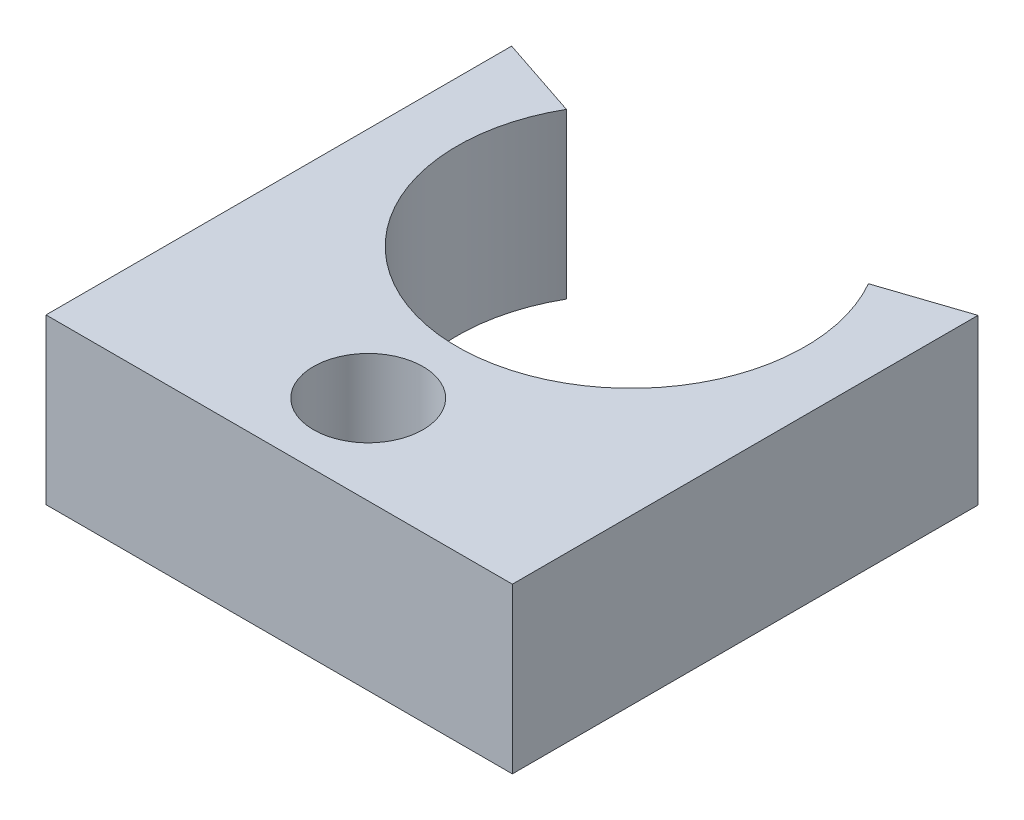
ISO-10303-21;
HEADER;
FILE_DESCRIPTION(('STEP AP214'),'2;1');
FILE_NAME('part.step','',(''),(''),'','','');
FILE_SCHEMA(('AUTOMOTIVE_DESIGN { 1 0 10303 214 1 1 1 1 }'));
ENDSEC;
DATA;
#1=APPLICATION_CONTEXT('core data for automotive mechanical design processes');
#2=APPLICATION_PROTOCOL_DEFINITION('international standard','automotive_design',2000,#1);
#3=PRODUCT_CONTEXT('',#1,'mechanical');
#4=PRODUCT('Part','Part','',(#3));
#5=PRODUCT_RELATED_PRODUCT_CATEGORY('part','',(#4));
#6=PRODUCT_DEFINITION_FORMATION('','',#4);
#7=PRODUCT_DEFINITION_CONTEXT('part definition',#1,'design');
#8=PRODUCT_DEFINITION('design','',#6,#7);
#9=PRODUCT_DEFINITION_SHAPE('','',#8);
#10=(LENGTH_UNIT() NAMED_UNIT(*) SI_UNIT(.MILLI.,.METRE.));
#11=(NAMED_UNIT(*) PLANE_ANGLE_UNIT() SI_UNIT($,.RADIAN.));
#12=(NAMED_UNIT(*) SI_UNIT($,.STERADIAN.) SOLID_ANGLE_UNIT());
#13=UNCERTAINTY_MEASURE_WITH_UNIT(LENGTH_MEASURE(1.E-05),#10,'distance_accuracy_value','');
#14=(GEOMETRIC_REPRESENTATION_CONTEXT(3) GLOBAL_UNCERTAINTY_ASSIGNED_CONTEXT((#13)) GLOBAL_UNIT_ASSIGNED_CONTEXT((#10,
#11,#12)) REPRESENTATION_CONTEXT('',''));
#15=CARTESIAN_POINT('',(0.,0.,0.));
#16=DIRECTION('',(0.,0.,1.));
#17=DIRECTION('',(1.,0.,0.));
#18=AXIS2_PLACEMENT_3D('',#15,#16,#17);
#19=CARTESIAN_POINT('',(-17.0272390016722,12.,-25.7));
#20=DIRECTION('',(0.,1.,0.));
#21=DIRECTION('',(0.,0.,1.));
#22=AXIS2_PLACEMENT_3D('',#19,#20,#21);
#23=PLANE('',#22);
#24=DIRECTION('',(-0.948683298050514,0.,-0.316227766016838));
#25=VECTOR('',#24,1.);
#26=CARTESIAN_POINT('',(-34.0544780033444,12.,-34.));
#27=LINE('',#26,#25);
#28=CARTESIAN_POINT('',(-28.0544780033444,12.,-32.));
#29=VERTEX_POINT('',#28);
#30=CARTESIAN_POINT('',(-34.0544780033444,12.,-34.));
#31=VERTEX_POINT('',#30);
#32=EDGE_CURVE('E152',#29,#31,#27,.T.);
#33=ORIENTED_EDGE('',*,*,#32,.T.);
#34=DIRECTION('',(0.,0.,1.));
#35=VECTOR('',#34,1.);
#36=CARTESIAN_POINT('',(-34.0544780033444,12.,-34.));
#37=LINE('',#36,#35);
#38=CARTESIAN_POINT('',(-34.0544780033444,12.,0.));
#39=VERTEX_POINT('',#38);
#40=EDGE_CURVE('E100',#31,#39,#37,.T.);
#41=ORIENTED_EDGE('',*,*,#40,.T.);
#42=DIRECTION('',(1.,0.,0.));
#43=VECTOR('',#42,1.);
#44=CARTESIAN_POINT('',(-34.0544780033444,12.,0.));
#45=LINE('',#44,#43);
#46=CARTESIAN_POINT('',(0.,12.,0.));
#47=VERTEX_POINT('',#46);
#48=EDGE_CURVE('E113',#39,#47,#45,.T.);
#49=ORIENTED_EDGE('',*,*,#48,.T.);
#50=DIRECTION('',(0.,0.,-1.));
#51=VECTOR('',#50,1.);
#52=CARTESIAN_POINT('',(0.,12.,0.));
#53=LINE('',#52,#51);
#54=CARTESIAN_POINT('',(0.,12.,-34.));
#55=VERTEX_POINT('',#54);
#56=EDGE_CURVE('E107',#47,#55,#53,.T.);
#57=ORIENTED_EDGE('',*,*,#56,.T.);
#58=DIRECTION('',(-0.948683298050515,0.,0.316227766016836));
#59=VECTOR('',#58,1.);
#60=CARTESIAN_POINT('',(0.,12.,-34.));
#61=LINE('',#60,#59);
#62=CARTESIAN_POINT('',(-6.00000000000001,12.,-32.));
#63=VERTEX_POINT('',#62);
#64=EDGE_CURVE('E111',#55,#63,#61,.T.);
#65=ORIENTED_EDGE('',*,*,#64,.T.);
#66=CARTESIAN_POINT('',(-17.0272390016722,12.,-25.7));
#67=DIRECTION('',(0.,-1.,0.));
#68=DIRECTION('',(0.,0.,1.));
#69=AXIS2_PLACEMENT_3D('',#66,#67,#68);
#70=CIRCLE('',#69,12.7);
#71=EDGE_CURVE('E63',#63,#29,#70,.T.);
#72=ORIENTED_EDGE('',*,*,#71,.T.);
#73=EDGE_LOOP('',(#33,#41,#49,#57,#65,#72));
#74=FACE_BOUND('',#73,.T.);
#75=CARTESIAN_POINT('',(-17.0272390016722,12.,-6.5));
#76=DIRECTION('',(0.,1.,0.));
#77=DIRECTION('',(0.,0.,1.));
#78=AXIS2_PLACEMENT_3D('',#75,#76,#77);
#79=CIRCLE('',#78,4.);
#80=CARTESIAN_POINT('',(-17.0272390016722,12.,-2.49999999999999));
#81=VERTEX_POINT('',#80);
#82=EDGE_CURVE('E140',#81,#81,#79,.T.);
#83=ORIENTED_EDGE('',*,*,#82,.F.);
#84=EDGE_LOOP('',(#83));
#85=FACE_BOUND('',#84,.T.);
#86=ADVANCED_FACE('F45',(#74,#85),#23,.T.);
#87=CARTESIAN_POINT('',(-17.0272390016722,0.,-25.7));
#88=DIRECTION('',(0.,1.,0.));
#89=DIRECTION('',(0.,0.,1.));
#90=AXIS2_PLACEMENT_3D('',#87,#88,#89);
#91=PLANE('',#90);
#92=DIRECTION('',(-0.948683298050514,0.,-0.316227766016838));
#93=VECTOR('',#92,1.);
#94=CARTESIAN_POINT('',(-34.0544780033444,0.,-34.));
#95=LINE('',#94,#93);
#96=CARTESIAN_POINT('',(-28.0544780033444,0.,-32.));
#97=VERTEX_POINT('',#96);
#98=CARTESIAN_POINT('',(-34.0544780033444,0.,-34.));
#99=VERTEX_POINT('',#98);
#100=EDGE_CURVE('E135',#97,#99,#95,.T.);
#101=ORIENTED_EDGE('',*,*,#100,.F.);
#102=CARTESIAN_POINT('',(-17.0272390016722,0.,-25.7));
#103=DIRECTION('',(0.,-1.,0.));
#104=DIRECTION('',(0.,0.,1.));
#105=AXIS2_PLACEMENT_3D('',#102,#103,#104);
#106=CIRCLE('',#105,12.7);
#107=CARTESIAN_POINT('',(-6.00000000000001,0.,-32.));
#108=VERTEX_POINT('',#107);
#109=EDGE_CURVE('E92',#108,#97,#106,.T.);
#110=ORIENTED_EDGE('',*,*,#109,.F.);
#111=DIRECTION('',(-0.948683298050515,0.,0.316227766016836));
#112=VECTOR('',#111,1.);
#113=CARTESIAN_POINT('',(0.,0.,-34.));
#114=LINE('',#113,#112);
#115=CARTESIAN_POINT('',(0.,0.,-34.));
#116=VERTEX_POINT('',#115);
#117=EDGE_CURVE('E86',#116,#108,#114,.T.);
#118=ORIENTED_EDGE('',*,*,#117,.F.);
#119=DIRECTION('',(0.,0.,-1.));
#120=VECTOR('',#119,1.);
#121=CARTESIAN_POINT('',(0.,0.,0.));
#122=LINE('',#121,#120);
#123=CARTESIAN_POINT('',(0.,0.,0.));
#124=VERTEX_POINT('',#123);
#125=EDGE_CURVE('E122',#124,#116,#122,.T.);
#126=ORIENTED_EDGE('',*,*,#125,.F.);
#127=DIRECTION('',(1.,0.,0.));
#128=VECTOR('',#127,1.);
#129=CARTESIAN_POINT('',(-34.0544780033444,0.,0.));
#130=LINE('',#129,#128);
#131=CARTESIAN_POINT('',(-34.0544780033444,0.,0.));
#132=VERTEX_POINT('',#131);
#133=EDGE_CURVE('E143',#132,#124,#130,.T.);
#134=ORIENTED_EDGE('',*,*,#133,.F.);
#135=DIRECTION('',(0.,0.,1.));
#136=VECTOR('',#135,1.);
#137=CARTESIAN_POINT('',(-34.0544780033444,0.,-34.));
#138=LINE('',#137,#136);
#139=EDGE_CURVE('E139',#99,#132,#138,.T.);
#140=ORIENTED_EDGE('',*,*,#139,.F.);
#141=EDGE_LOOP('',(#101,#110,#118,#126,#134,#140));
#142=FACE_BOUND('',#141,.T.);
#143=CARTESIAN_POINT('',(-17.0272390016722,0.,-6.5));
#144=DIRECTION('',(0.,1.,0.));
#145=DIRECTION('',(0.,0.,1.));
#146=AXIS2_PLACEMENT_3D('',#143,#144,#145);
#147=CIRCLE('',#146,4.);
#148=CARTESIAN_POINT('',(-17.0272390016722,0.,-2.49999999999999));
#149=VERTEX_POINT('',#148);
#150=EDGE_CURVE('E249',#149,#149,#147,.T.);
#151=ORIENTED_EDGE('',*,*,#150,.T.);
#152=EDGE_LOOP('',(#151));
#153=FACE_BOUND('',#152,.T.);
#154=ADVANCED_FACE('F165',(#142,#153),#91,.F.);
#155=CARTESIAN_POINT('',(-34.0544780033444,12.,-34.));
#156=DIRECTION('',(-0.316227766016838,0.,0.948683298050514));
#157=DIRECTION('',(0.948683298050514,0.,0.316227766016838));
#158=AXIS2_PLACEMENT_3D('',#155,#156,#157);
#159=PLANE('',#158);
#160=ORIENTED_EDGE('',*,*,#100,.T.);
#161=DIRECTION('',(0.,-1.,0.));
#162=VECTOR('',#161,1.);
#163=CARTESIAN_POINT('',(-34.0544780033444,12.,-34.));
#164=LINE('',#163,#162);
#165=EDGE_CURVE('E11',#31,#99,#164,.T.);
#166=ORIENTED_EDGE('',*,*,#165,.F.);
#167=ORIENTED_EDGE('',*,*,#32,.F.);
#168=DIRECTION('',(0.,-1.,0.));
#169=VECTOR('',#168,1.);
#170=CARTESIAN_POINT('',(-28.0544780033444,12.,-32.));
#171=LINE('',#170,#169);
#172=EDGE_CURVE('E131',#29,#97,#171,.T.);
#173=ORIENTED_EDGE('',*,*,#172,.T.);
#174=EDGE_LOOP('',(#160,#166,#167,#173));
#175=FACE_BOUND('',#174,.T.);
#176=ADVANCED_FACE('F47',(#175),#159,.F.);
#177=CARTESIAN_POINT('',(-34.0544780033444,12.,-34.));
#178=DIRECTION('',(1.,0.,0.));
#179=DIRECTION('',(0.,0.,-1.));
#180=AXIS2_PLACEMENT_3D('',#177,#178,#179);
#181=PLANE('',#180);
#182=ORIENTED_EDGE('',*,*,#139,.T.);
#183=DIRECTION('',(0.,-1.,0.));
#184=VECTOR('',#183,1.);
#185=CARTESIAN_POINT('',(-34.0544780033444,12.,0.));
#186=LINE('',#185,#184);
#187=EDGE_CURVE('E55',#39,#132,#186,.T.);
#188=ORIENTED_EDGE('',*,*,#187,.F.);
#189=ORIENTED_EDGE('',*,*,#40,.F.);
#190=ORIENTED_EDGE('',*,*,#165,.T.);
#191=EDGE_LOOP('',(#182,#188,#189,#190));
#192=FACE_BOUND('',#191,.T.);
#193=ADVANCED_FACE('F190',(#192),#181,.F.);
#194=CARTESIAN_POINT('',(-34.0544780033444,12.,0.));
#195=DIRECTION('',(0.,0.,-1.));
#196=DIRECTION('',(-1.,0.,0.));
#197=AXIS2_PLACEMENT_3D('',#194,#195,#196);
#198=PLANE('',#197);
#199=ORIENTED_EDGE('',*,*,#133,.T.);
#200=DIRECTION('',(0.,-1.,0.));
#201=VECTOR('',#200,1.);
#202=CARTESIAN_POINT('',(0.,12.,0.));
#203=LINE('',#202,#201);
#204=EDGE_CURVE('E124',#47,#124,#203,.T.);
#205=ORIENTED_EDGE('',*,*,#204,.F.);
#206=ORIENTED_EDGE('',*,*,#48,.F.);
#207=ORIENTED_EDGE('',*,*,#187,.T.);
#208=EDGE_LOOP('',(#199,#205,#206,#207));
#209=FACE_BOUND('',#208,.T.);
#210=ADVANCED_FACE('F162',(#209),#198,.F.);
#211=CARTESIAN_POINT('',(0.,12.,0.));
#212=DIRECTION('',(-1.,0.,0.));
#213=DIRECTION('',(0.,0.,1.));
#214=AXIS2_PLACEMENT_3D('',#211,#212,#213);
#215=PLANE('',#214);
#216=ORIENTED_EDGE('',*,*,#125,.T.);
#217=DIRECTION('',(0.,-1.,0.));
#218=VECTOR('',#217,1.);
#219=CARTESIAN_POINT('',(0.,12.,-34.));
#220=LINE('',#219,#218);
#221=EDGE_CURVE('E119',#55,#116,#220,.T.);
#222=ORIENTED_EDGE('',*,*,#221,.F.);
#223=ORIENTED_EDGE('',*,*,#56,.F.);
#224=ORIENTED_EDGE('',*,*,#204,.T.);
#225=EDGE_LOOP('',(#216,#222,#223,#224));
#226=FACE_BOUND('',#225,.T.);
#227=ADVANCED_FACE('F120',(#226),#215,.F.);
#228=CARTESIAN_POINT('',(0.,12.,-34.));
#229=DIRECTION('',(0.316227766016836,0.,0.948683298050514));
#230=DIRECTION('',(0.948683298050514,0.,-0.316227766016836));
#231=AXIS2_PLACEMENT_3D('',#228,#229,#230);
#232=PLANE('',#231);
#233=ORIENTED_EDGE('',*,*,#117,.T.);
#234=DIRECTION('',(0.,-1.,0.));
#235=VECTOR('',#234,1.);
#236=CARTESIAN_POINT('',(-6.00000000000001,12.,-32.));
#237=LINE('',#236,#235);
#238=EDGE_CURVE('E125',#63,#108,#237,.T.);
#239=ORIENTED_EDGE('',*,*,#238,.F.);
#240=ORIENTED_EDGE('',*,*,#64,.F.);
#241=ORIENTED_EDGE('',*,*,#221,.T.);
#242=EDGE_LOOP('',(#233,#239,#240,#241));
#243=FACE_BOUND('',#242,.T.);
#244=ADVANCED_FACE('F127',(#243),#232,.F.);
#245=CARTESIAN_POINT('',(-17.0272390016722,12.,-25.7));
#246=DIRECTION('',(0.,-1.,0.));
#247=DIRECTION('',(0.,0.,-1.));
#248=AXIS2_PLACEMENT_3D('',#245,#246,#247);
#249=CYLINDRICAL_SURFACE('',#248,12.7);
#250=ORIENTED_EDGE('',*,*,#109,.T.);
#251=ORIENTED_EDGE('',*,*,#172,.F.);
#252=ORIENTED_EDGE('',*,*,#71,.F.);
#253=ORIENTED_EDGE('',*,*,#238,.T.);
#254=EDGE_LOOP('',(#250,#251,#252,#253));
#255=FACE_BOUND('',#254,.T.);
#256=ADVANCED_FACE('F170',(#255),#249,.F.);
#257=CARTESIAN_POINT('',(-17.0272390016722,12.,-6.5));
#258=DIRECTION('',(0.,-1.,0.));
#259=DIRECTION('',(0.,0.,-1.));
#260=AXIS2_PLACEMENT_3D('',#257,#258,#259);
#261=CYLINDRICAL_SURFACE('',#260,4.);
#262=ORIENTED_EDGE('',*,*,#82,.T.);
#263=EDGE_LOOP('',(#262));
#264=FACE_BOUND('',#263,.T.);
#265=ORIENTED_EDGE('',*,*,#150,.F.);
#266=EDGE_LOOP('',(#265));
#267=FACE_BOUND('',#266,.T.);
#268=ADVANCED_FACE('F172',(#264,#267),#261,.F.);
#269=CLOSED_SHELL('',(#86,#154,#176,#193,#210,#227,#244,#256,#268));
#270=MANIFOLD_SOLID_BREP('B2',#269);
#271=ADVANCED_BREP_SHAPE_REPRESENTATION('',(#18,#270),#14);
#272=SHAPE_DEFINITION_REPRESENTATION(#9,#271);
ENDSEC;
END-ISO-10303-21;
